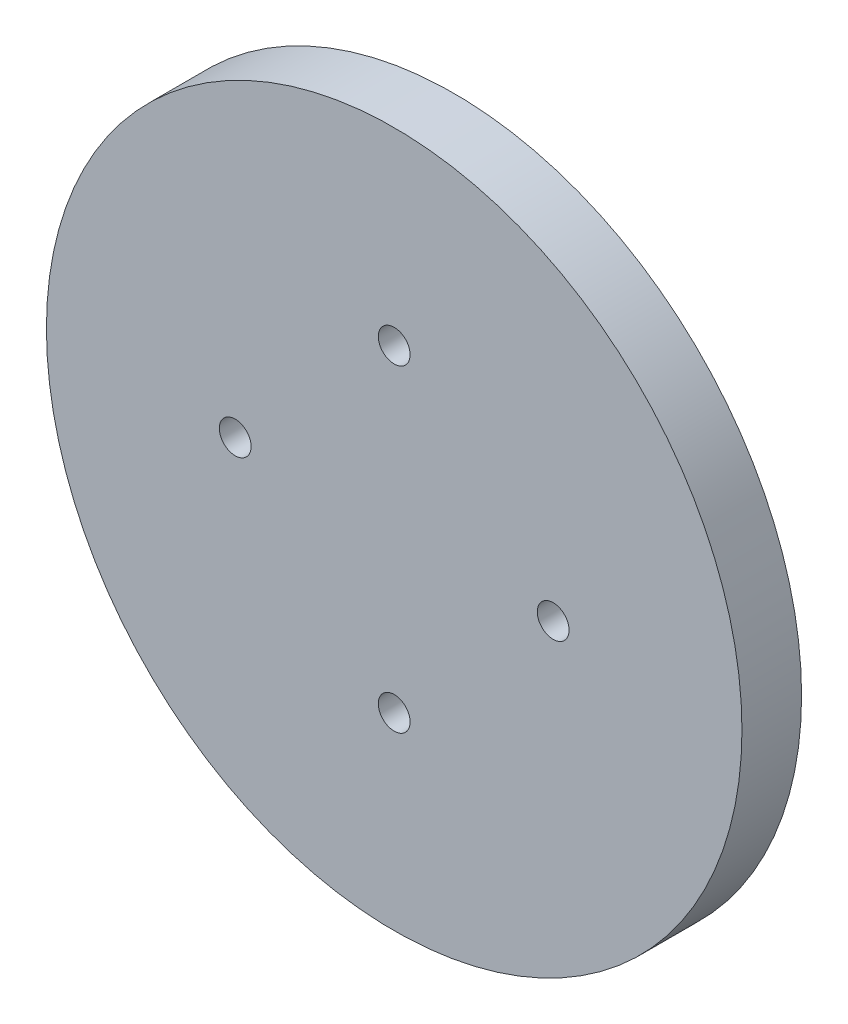
ISO-10303-21;
HEADER;
FILE_DESCRIPTION(('STEP AP214'),'2;1');
FILE_NAME('part.step','',(''),(''),'','','');
FILE_SCHEMA(('AUTOMOTIVE_DESIGN { 1 0 10303 214 1 1 1 1 }'));
ENDSEC;
DATA;
#1=APPLICATION_CONTEXT('core data for automotive mechanical design processes');
#2=APPLICATION_PROTOCOL_DEFINITION('international standard','automotive_design',2000,#1);
#3=PRODUCT_CONTEXT('',#1,'mechanical');
#4=PRODUCT('Part','Part','',(#3));
#5=PRODUCT_RELATED_PRODUCT_CATEGORY('part','',(#4));
#6=PRODUCT_DEFINITION_FORMATION('','',#4);
#7=PRODUCT_DEFINITION_CONTEXT('part definition',#1,'design');
#8=PRODUCT_DEFINITION('design','',#6,#7);
#9=PRODUCT_DEFINITION_SHAPE('','',#8);
#10=(LENGTH_UNIT() NAMED_UNIT(*) SI_UNIT(.MILLI.,.METRE.));
#11=(NAMED_UNIT(*) PLANE_ANGLE_UNIT() SI_UNIT($,.RADIAN.));
#12=(NAMED_UNIT(*) SI_UNIT($,.STERADIAN.) SOLID_ANGLE_UNIT());
#13=UNCERTAINTY_MEASURE_WITH_UNIT(LENGTH_MEASURE(1.E-05),#10,'distance_accuracy_value','');
#14=(GEOMETRIC_REPRESENTATION_CONTEXT(3) GLOBAL_UNCERTAINTY_ASSIGNED_CONTEXT((#13)) GLOBAL_UNIT_ASSIGNED_CONTEXT((#10,
#11,#12)) REPRESENTATION_CONTEXT('',''));
#15=CARTESIAN_POINT('',(0.,0.,0.));
#16=DIRECTION('',(0.,0.,1.));
#17=DIRECTION('',(1.,0.,0.));
#18=AXIS2_PLACEMENT_3D('',#15,#16,#17);
#19=CARTESIAN_POINT('',(0.,0.,3.));
#20=DIRECTION('',(0.,0.,-1.));
#21=DIRECTION('',(-1.,0.,0.));
#22=AXIS2_PLACEMENT_3D('',#19,#20,#21);
#23=CYLINDRICAL_SURFACE('',#22,17.5);
#24=CARTESIAN_POINT('',(0.,0.,3.));
#25=DIRECTION('',(0.,0.,1.));
#26=DIRECTION('',(1.,0.,0.));
#27=AXIS2_PLACEMENT_3D('',#24,#25,#26);
#28=CIRCLE('',#27,17.5);
#29=CARTESIAN_POINT('',(17.5,0.,3.));
#30=VERTEX_POINT('',#29);
#31=EDGE_CURVE('E10',#30,#30,#28,.T.);
#32=ORIENTED_EDGE('',*,*,#31,.F.);
#33=EDGE_LOOP('',(#32));
#34=FACE_BOUND('',#33,.T.);
#35=CARTESIAN_POINT('',(0.,0.,0.));
#36=DIRECTION('',(0.,0.,1.));
#37=DIRECTION('',(1.,0.,0.));
#38=AXIS2_PLACEMENT_3D('',#35,#36,#37);
#39=CIRCLE('',#38,17.5);
#40=CARTESIAN_POINT('',(17.5,0.,0.));
#41=VERTEX_POINT('',#40);
#42=EDGE_CURVE('E40',#41,#41,#39,.T.);
#43=ORIENTED_EDGE('',*,*,#42,.T.);
#44=EDGE_LOOP('',(#43));
#45=FACE_BOUND('',#44,.T.);
#46=ADVANCED_FACE('F37',(#34,#45),#23,.T.);
#47=CARTESIAN_POINT('',(0.,0.,3.));
#48=DIRECTION('',(0.,0.,1.));
#49=DIRECTION('',(1.,0.,0.));
#50=AXIS2_PLACEMENT_3D('',#47,#48,#49);
#51=PLANE('',#50);
#52=CARTESIAN_POINT('',(8.,0.,3.));
#53=DIRECTION('',(0.,0.,1.));
#54=DIRECTION('',(0.,-1.,0.));
#55=AXIS2_PLACEMENT_3D('',#52,#53,#54);
#56=CIRCLE('',#55,0.8);
#57=CARTESIAN_POINT('',(8.,-0.800000000000028,3.));
#58=VERTEX_POINT('',#57);
#59=EDGE_CURVE('E58',#58,#58,#56,.T.);
#60=ORIENTED_EDGE('',*,*,#59,.F.);
#61=EDGE_LOOP('',(#60));
#62=FACE_BOUND('',#61,.T.);
#63=CARTESIAN_POINT('',(0.,-8.,3.));
#64=DIRECTION('',(0.,0.,1.));
#65=DIRECTION('',(-1.,0.,0.));
#66=AXIS2_PLACEMENT_3D('',#63,#64,#65);
#67=CIRCLE('',#66,0.8);
#68=CARTESIAN_POINT('',(-0.8,-8.,3.));
#69=VERTEX_POINT('',#68);
#70=EDGE_CURVE('E68',#69,#69,#67,.T.);
#71=ORIENTED_EDGE('',*,*,#70,.F.);
#72=EDGE_LOOP('',(#71));
#73=FACE_BOUND('',#72,.T.);
#74=CARTESIAN_POINT('',(-8.,0.,3.));
#75=DIRECTION('',(0.,0.,1.));
#76=DIRECTION('',(0.,1.,0.));
#77=AXIS2_PLACEMENT_3D('',#74,#75,#76);
#78=CIRCLE('',#77,0.8);
#79=CARTESIAN_POINT('',(-7.99999999999999,0.800000000000084,3.));
#80=VERTEX_POINT('',#79);
#81=EDGE_CURVE('E59',#80,#80,#78,.T.);
#82=ORIENTED_EDGE('',*,*,#81,.F.);
#83=EDGE_LOOP('',(#82));
#84=FACE_BOUND('',#83,.T.);
#85=CARTESIAN_POINT('',(0.,8.,3.));
#86=DIRECTION('',(0.,0.,1.));
#87=DIRECTION('',(1.,0.,0.));
#88=AXIS2_PLACEMENT_3D('',#85,#86,#87);
#89=CIRCLE('',#88,0.8);
#90=CARTESIAN_POINT('',(0.8,8.,3.));
#91=VERTEX_POINT('',#90);
#92=EDGE_CURVE('E54',#91,#91,#89,.T.);
#93=ORIENTED_EDGE('',*,*,#92,.F.);
#94=EDGE_LOOP('',(#93));
#95=FACE_BOUND('',#94,.T.);
#96=ORIENTED_EDGE('',*,*,#31,.T.);
#97=EDGE_LOOP('',(#96));
#98=FACE_BOUND('',#97,.T.);
#99=ADVANCED_FACE('F90',(#62,#73,#84,#95,#98),#51,.T.);
#100=CARTESIAN_POINT('',(0.,0.,0.));
#101=DIRECTION('',(0.,0.,1.));
#102=DIRECTION('',(1.,0.,0.));
#103=AXIS2_PLACEMENT_3D('',#100,#101,#102);
#104=PLANE('',#103);
#105=CARTESIAN_POINT('',(8.,0.,0.));
#106=DIRECTION('',(0.,0.,1.));
#107=DIRECTION('',(0.,-1.,0.));
#108=AXIS2_PLACEMENT_3D('',#105,#106,#107);
#109=CIRCLE('',#108,0.8);
#110=CARTESIAN_POINT('',(8.,-0.800000000000028,0.));
#111=VERTEX_POINT('',#110);
#112=EDGE_CURVE('E72',#111,#111,#109,.F.);
#113=ORIENTED_EDGE('',*,*,#112,.F.);
#114=EDGE_LOOP('',(#113));
#115=FACE_BOUND('',#114,.T.);
#116=CARTESIAN_POINT('',(0.,-8.,0.));
#117=DIRECTION('',(0.,0.,1.));
#118=DIRECTION('',(-1.,0.,0.));
#119=AXIS2_PLACEMENT_3D('',#116,#117,#118);
#120=CIRCLE('',#119,0.8);
#121=CARTESIAN_POINT('',(-0.8,-8.,0.));
#122=VERTEX_POINT('',#121);
#123=EDGE_CURVE('E63',#122,#122,#120,.F.);
#124=ORIENTED_EDGE('',*,*,#123,.F.);
#125=EDGE_LOOP('',(#124));
#126=FACE_BOUND('',#125,.T.);
#127=CARTESIAN_POINT('',(-8.,0.,0.));
#128=DIRECTION('',(0.,0.,1.));
#129=DIRECTION('',(0.,1.,0.));
#130=AXIS2_PLACEMENT_3D('',#127,#128,#129);
#131=CIRCLE('',#130,0.8);
#132=CARTESIAN_POINT('',(-7.99999999999999,0.800000000000084,0.));
#133=VERTEX_POINT('',#132);
#134=EDGE_CURVE('E64',#133,#133,#131,.F.);
#135=ORIENTED_EDGE('',*,*,#134,.F.);
#136=EDGE_LOOP('',(#135));
#137=FACE_BOUND('',#136,.T.);
#138=CARTESIAN_POINT('',(0.,8.,0.));
#139=DIRECTION('',(0.,0.,1.));
#140=DIRECTION('',(1.,0.,0.));
#141=AXIS2_PLACEMENT_3D('',#138,#139,#140);
#142=CIRCLE('',#141,0.8);
#143=CARTESIAN_POINT('',(0.8,8.,0.));
#144=VERTEX_POINT('',#143);
#145=EDGE_CURVE('E49',#144,#144,#142,.F.);
#146=ORIENTED_EDGE('',*,*,#145,.F.);
#147=EDGE_LOOP('',(#146));
#148=FACE_BOUND('',#147,.T.);
#149=ORIENTED_EDGE('',*,*,#42,.F.);
#150=EDGE_LOOP('',(#149));
#151=FACE_BOUND('',#150,.T.);
#152=ADVANCED_FACE('F86',(#115,#126,#137,#148,#151),#104,.F.);
#153=CARTESIAN_POINT('',(0.,8.,-2.26274169979695));
#154=DIRECTION('',(0.,0.,1.));
#155=DIRECTION('',(1.,0.,0.));
#156=AXIS2_PLACEMENT_3D('',#153,#154,#155);
#157=CYLINDRICAL_SURFACE('',#156,0.8);
#158=ORIENTED_EDGE('',*,*,#145,.T.);
#159=EDGE_LOOP('',(#158));
#160=FACE_BOUND('',#159,.T.);
#161=ORIENTED_EDGE('',*,*,#92,.T.);
#162=EDGE_LOOP('',(#161));
#163=FACE_BOUND('',#162,.T.);
#164=ADVANCED_FACE('F89',(#160,#163),#157,.F.);
#165=CARTESIAN_POINT('',(-8.,0.,-2.26274169979695));
#166=DIRECTION('',(0.,0.,1.));
#167=DIRECTION('',(0.,1.,0.));
#168=AXIS2_PLACEMENT_3D('',#165,#166,#167);
#169=CYLINDRICAL_SURFACE('',#168,0.8);
#170=ORIENTED_EDGE('',*,*,#134,.T.);
#171=EDGE_LOOP('',(#170));
#172=FACE_BOUND('',#171,.T.);
#173=ORIENTED_EDGE('',*,*,#81,.T.);
#174=EDGE_LOOP('',(#173));
#175=FACE_BOUND('',#174,.T.);
#176=ADVANCED_FACE('F113',(#172,#175),#169,.F.);
#177=CARTESIAN_POINT('',(0.,-8.,-2.26274169979695));
#178=DIRECTION('',(0.,0.,1.));
#179=DIRECTION('',(-1.,0.,0.));
#180=AXIS2_PLACEMENT_3D('',#177,#178,#179);
#181=CYLINDRICAL_SURFACE('',#180,0.8);
#182=ORIENTED_EDGE('',*,*,#123,.T.);
#183=EDGE_LOOP('',(#182));
#184=FACE_BOUND('',#183,.T.);
#185=ORIENTED_EDGE('',*,*,#70,.T.);
#186=EDGE_LOOP('',(#185));
#187=FACE_BOUND('',#186,.T.);
#188=ADVANCED_FACE('F117',(#184,#187),#181,.F.);
#189=CARTESIAN_POINT('',(8.,0.,-2.26274169979695));
#190=DIRECTION('',(0.,0.,1.));
#191=DIRECTION('',(0.,-1.,0.));
#192=AXIS2_PLACEMENT_3D('',#189,#190,#191);
#193=CYLINDRICAL_SURFACE('',#192,0.8);
#194=ORIENTED_EDGE('',*,*,#112,.T.);
#195=EDGE_LOOP('',(#194));
#196=FACE_BOUND('',#195,.T.);
#197=ORIENTED_EDGE('',*,*,#59,.T.);
#198=EDGE_LOOP('',(#197));
#199=FACE_BOUND('',#198,.T.);
#200=ADVANCED_FACE('F83',(#196,#199),#193,.F.);
#201=CLOSED_SHELL('',(#46,#99,#152,#164,#176,#188,#200));
#202=MANIFOLD_SOLID_BREP('B2',#201);
#203=ADVANCED_BREP_SHAPE_REPRESENTATION('',(#18,#202),#14);
#204=SHAPE_DEFINITION_REPRESENTATION(#9,#203);
ENDSEC;
END-ISO-10303-21;
